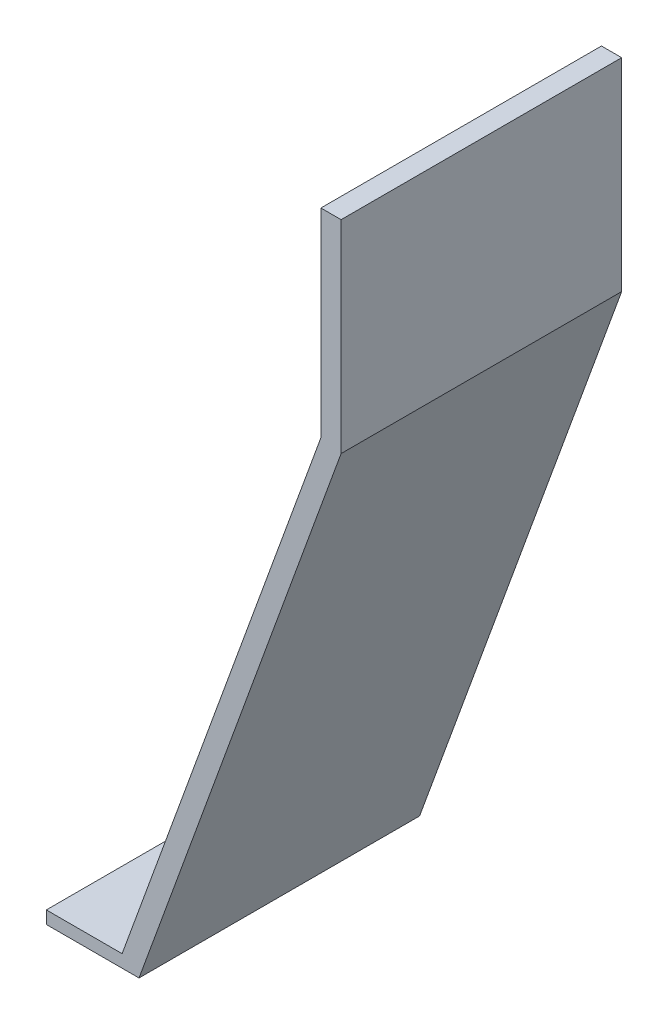
ISO-10303-21;
HEADER;
FILE_DESCRIPTION(('STEP AP214'),'2;1');
FILE_NAME('part.step','',(''),(''),'','','');
FILE_SCHEMA(('AUTOMOTIVE_DESIGN { 1 0 10303 214 1 1 1 1 }'));
ENDSEC;
DATA;
#1=APPLICATION_CONTEXT('core data for automotive mechanical design processes');
#2=APPLICATION_PROTOCOL_DEFINITION('international standard','automotive_design',2000,#1);
#3=PRODUCT_CONTEXT('',#1,'mechanical');
#4=PRODUCT('Part','Part','',(#3));
#5=PRODUCT_RELATED_PRODUCT_CATEGORY('part','',(#4));
#6=PRODUCT_DEFINITION_FORMATION('','',#4);
#7=PRODUCT_DEFINITION_CONTEXT('part definition',#1,'design');
#8=PRODUCT_DEFINITION('design','',#6,#7);
#9=PRODUCT_DEFINITION_SHAPE('','',#8);
#10=(LENGTH_UNIT() NAMED_UNIT(*) SI_UNIT(.MILLI.,.METRE.));
#11=(NAMED_UNIT(*) PLANE_ANGLE_UNIT() SI_UNIT($,.RADIAN.));
#12=(NAMED_UNIT(*) SI_UNIT($,.STERADIAN.) SOLID_ANGLE_UNIT());
#13=UNCERTAINTY_MEASURE_WITH_UNIT(LENGTH_MEASURE(1.E-05),#10,'distance_accuracy_value','');
#14=(GEOMETRIC_REPRESENTATION_CONTEXT(3) GLOBAL_UNCERTAINTY_ASSIGNED_CONTEXT((#13)) GLOBAL_UNIT_ASSIGNED_CONTEXT((#10,
#11,#12)) REPRESENTATION_CONTEXT('',''));
#15=CARTESIAN_POINT('',(0.,0.,0.));
#16=DIRECTION('',(0.,0.,1.));
#17=DIRECTION('',(1.,0.,0.));
#18=AXIS2_PLACEMENT_3D('',#15,#16,#17);
#19=CARTESIAN_POINT('',(0.,2.5,55.54));
#20=DIRECTION('',(1.,0.,0.));
#21=DIRECTION('',(0.,0.,-1.));
#22=AXIS2_PLACEMENT_3D('',#19,#20,#21);
#23=PLANE('',#22);
#24=DIRECTION('',(0.,-1.,0.));
#25=VECTOR('',#24,1.);
#26=CARTESIAN_POINT('',(0.,2.5,0.));
#27=LINE('',#26,#25);
#28=CARTESIAN_POINT('',(0.,2.5,0.));
#29=VERTEX_POINT('',#28);
#30=CARTESIAN_POINT('',(0.,0.,0.));
#31=VERTEX_POINT('',#30);
#32=EDGE_CURVE('E133',#29,#31,#27,.T.);
#33=ORIENTED_EDGE('',*,*,#32,.T.);
#34=DIRECTION('',(0.,0.,-1.));
#35=VECTOR('',#34,1.);
#36=CARTESIAN_POINT('',(0.,0.,55.54));
#37=LINE('',#36,#35);
#38=CARTESIAN_POINT('',(0.,0.,55.54));
#39=VERTEX_POINT('',#38);
#40=EDGE_CURVE('E11',#39,#31,#37,.T.);
#41=ORIENTED_EDGE('',*,*,#40,.F.);
#42=DIRECTION('',(0.,-1.,0.));
#43=VECTOR('',#42,1.);
#44=CARTESIAN_POINT('',(0.,2.5,55.54));
#45=LINE('',#44,#43);
#46=CARTESIAN_POINT('',(0.,2.5,55.54));
#47=VERTEX_POINT('',#46);
#48=EDGE_CURVE('E149',#47,#39,#45,.T.);
#49=ORIENTED_EDGE('',*,*,#48,.F.);
#50=DIRECTION('',(0.,0.,-1.));
#51=VECTOR('',#50,1.);
#52=CARTESIAN_POINT('',(0.,2.5,55.54));
#53=LINE('',#52,#51);
#54=EDGE_CURVE('E132',#47,#29,#53,.T.);
#55=ORIENTED_EDGE('',*,*,#54,.T.);
#56=EDGE_LOOP('',(#33,#41,#49,#55));
#57=FACE_BOUND('',#56,.T.);
#58=ADVANCED_FACE('F39',(#57),#23,.F.);
#59=CARTESIAN_POINT('',(0.,0.,55.54));
#60=DIRECTION('',(0.,1.,0.));
#61=DIRECTION('',(0.,0.,1.));
#62=AXIS2_PLACEMENT_3D('',#59,#60,#61);
#63=PLANE('',#62);
#64=DIRECTION('',(1.,0.,0.));
#65=VECTOR('',#64,1.);
#66=CARTESIAN_POINT('',(0.,0.,0.));
#67=LINE('',#66,#65);
#68=CARTESIAN_POINT('',(18.3467855042381,0.,0.));
#69=VERTEX_POINT('',#68);
#70=EDGE_CURVE('E137',#31,#69,#67,.T.);
#71=ORIENTED_EDGE('',*,*,#70,.T.);
#72=DIRECTION('',(0.,0.,-1.));
#73=VECTOR('',#72,1.);
#74=CARTESIAN_POINT('',(18.3467855042381,0.,55.54));
#75=LINE('',#74,#73);
#76=CARTESIAN_POINT('',(18.3467855042381,0.,55.54));
#77=VERTEX_POINT('',#76);
#78=EDGE_CURVE('E50',#77,#69,#75,.T.);
#79=ORIENTED_EDGE('',*,*,#78,.F.);
#80=DIRECTION('',(1.,0.,0.));
#81=VECTOR('',#80,1.);
#82=CARTESIAN_POINT('',(0.,0.,55.54));
#83=LINE('',#82,#81);
#84=EDGE_CURVE('E98',#39,#77,#83,.T.);
#85=ORIENTED_EDGE('',*,*,#84,.F.);
#86=ORIENTED_EDGE('',*,*,#40,.T.);
#87=EDGE_LOOP('',(#71,#79,#85,#86));
#88=FACE_BOUND('',#87,.T.);
#89=ADVANCED_FACE('F184',(#88),#63,.F.);
#90=CARTESIAN_POINT('',(18.3467855042381,0.,55.54));
#91=DIRECTION('',(-0.93969262078591,0.342020143325665,0.));
#92=DIRECTION('',(-0.342020143325665,-0.93969262078591,0.));
#93=AXIS2_PLACEMENT_3D('',#90,#91,#92);
#94=PLANE('',#93);
#95=DIRECTION('',(0.342020143325665,0.93969262078591,0.));
#96=VECTOR('',#95,1.);
#97=CARTESIAN_POINT('',(18.3467855042381,0.,0.));
#98=LINE('',#97,#96);
#99=CARTESIAN_POINT('',(58.3467855042381,109.899096778186,0.));
#100=VERTEX_POINT('',#99);
#101=EDGE_CURVE('E139',#69,#100,#98,.T.);
#102=ORIENTED_EDGE('',*,*,#101,.T.);
#103=DIRECTION('',(0.,0.,-1.));
#104=VECTOR('',#103,1.);
#105=CARTESIAN_POINT('',(58.3467855042381,109.899096778186,55.54));
#106=LINE('',#105,#104);
#107=CARTESIAN_POINT('',(58.3467855042381,109.899096778186,55.54));
#108=VERTEX_POINT('',#107);
#109=EDGE_CURVE('E156',#108,#100,#106,.T.);
#110=ORIENTED_EDGE('',*,*,#109,.F.);
#111=DIRECTION('',(0.342020143325665,0.93969262078591,0.));
#112=VECTOR('',#111,1.);
#113=CARTESIAN_POINT('',(18.3467855042381,0.,55.54));
#114=LINE('',#113,#112);
#115=EDGE_CURVE('E163',#77,#108,#114,.T.);
#116=ORIENTED_EDGE('',*,*,#115,.F.);
#117=ORIENTED_EDGE('',*,*,#78,.T.);
#118=EDGE_LOOP('',(#102,#110,#116,#117));
#119=FACE_BOUND('',#118,.T.);
#120=ADVANCED_FACE('F165',(#119),#94,.F.);
#121=CARTESIAN_POINT('',(58.3467855042381,109.899096778186,55.54));
#122=DIRECTION('',(-1.,0.,0.));
#123=DIRECTION('',(0.,-1.,0.));
#124=AXIS2_PLACEMENT_3D('',#121,#122,#123);
#125=PLANE('',#124);
#126=DIRECTION('',(0.,1.,0.));
#127=VECTOR('',#126,1.);
#128=CARTESIAN_POINT('',(58.3467855042381,109.899096778186,0.));
#129=LINE('',#128,#127);
#130=CARTESIAN_POINT('',(58.3467855042381,150.,0.));
#131=VERTEX_POINT('',#130);
#132=EDGE_CURVE('E142',#100,#131,#129,.T.);
#133=ORIENTED_EDGE('',*,*,#132,.T.);
#134=DIRECTION('',(0.,0.,-1.));
#135=VECTOR('',#134,1.);
#136=CARTESIAN_POINT('',(58.3467855042381,150.,55.54));
#137=LINE('',#136,#135);
#138=CARTESIAN_POINT('',(58.3467855042381,150.,55.54));
#139=VERTEX_POINT('',#138);
#140=EDGE_CURVE('E153',#139,#131,#137,.T.);
#141=ORIENTED_EDGE('',*,*,#140,.F.);
#142=DIRECTION('',(0.,1.,0.));
#143=VECTOR('',#142,1.);
#144=CARTESIAN_POINT('',(58.3467855042381,109.899096778186,55.54));
#145=LINE('',#144,#143);
#146=EDGE_CURVE('E176',#108,#139,#145,.T.);
#147=ORIENTED_EDGE('',*,*,#146,.F.);
#148=ORIENTED_EDGE('',*,*,#109,.T.);
#149=EDGE_LOOP('',(#133,#141,#147,#148));
#150=FACE_BOUND('',#149,.T.);
#151=ADVANCED_FACE('F175',(#150),#125,.F.);
#152=CARTESIAN_POINT('',(58.3467855042381,150.,55.54));
#153=DIRECTION('',(0.,-1.,0.));
#154=DIRECTION('',(0.,0.,-1.));
#155=AXIS2_PLACEMENT_3D('',#152,#153,#154);
#156=PLANE('',#155);
#157=DIRECTION('',(-1.,0.,0.));
#158=VECTOR('',#157,1.);
#159=CARTESIAN_POINT('',(58.3467855042381,150.,0.));
#160=LINE('',#159,#158);
#161=CARTESIAN_POINT('',(54.3467855042381,150.,0.));
#162=VERTEX_POINT('',#161);
#163=EDGE_CURVE('E145',#131,#162,#160,.T.);
#164=ORIENTED_EDGE('',*,*,#163,.T.);
#165=DIRECTION('',(0.,0.,-1.));
#166=VECTOR('',#165,1.);
#167=CARTESIAN_POINT('',(54.3467855042381,150.,55.54));
#168=LINE('',#167,#166);
#169=CARTESIAN_POINT('',(54.3467855042381,150.,55.54));
#170=VERTEX_POINT('',#169);
#171=EDGE_CURVE('E127',#170,#162,#168,.T.);
#172=ORIENTED_EDGE('',*,*,#171,.F.);
#173=DIRECTION('',(-1.,0.,0.));
#174=VECTOR('',#173,1.);
#175=CARTESIAN_POINT('',(58.3467855042381,150.,55.54));
#176=LINE('',#175,#174);
#177=EDGE_CURVE('E120',#139,#170,#176,.T.);
#178=ORIENTED_EDGE('',*,*,#177,.F.);
#179=ORIENTED_EDGE('',*,*,#140,.T.);
#180=EDGE_LOOP('',(#164,#172,#178,#179));
#181=FACE_BOUND('',#180,.T.);
#182=ADVANCED_FACE('F173',(#181),#156,.F.);
#183=CARTESIAN_POINT('',(54.3467855042381,150.,55.54));
#184=DIRECTION('',(1.,0.,0.));
#185=DIRECTION('',(0.,1.,0.));
#186=AXIS2_PLACEMENT_3D('',#183,#184,#185);
#187=PLANE('',#186);
#188=DIRECTION('',(0.,-1.,0.));
#189=VECTOR('',#188,1.);
#190=CARTESIAN_POINT('',(54.3467855042381,150.,0.));
#191=LINE('',#190,#189);
#192=CARTESIAN_POINT('',(54.3467855042381,110.60440470102,0.));
#193=VERTEX_POINT('',#192);
#194=EDGE_CURVE('E124',#162,#193,#191,.T.);
#195=ORIENTED_EDGE('',*,*,#194,.T.);
#196=DIRECTION('',(0.,0.,-1.));
#197=VECTOR('',#196,1.);
#198=CARTESIAN_POINT('',(54.3467855042381,110.60440470102,55.54));
#199=LINE('',#198,#197);
#200=CARTESIAN_POINT('',(54.3467855042381,110.60440470102,55.54));
#201=VERTEX_POINT('',#200);
#202=EDGE_CURVE('E125',#201,#193,#199,.T.);
#203=ORIENTED_EDGE('',*,*,#202,.F.);
#204=DIRECTION('',(0.,-1.,0.));
#205=VECTOR('',#204,1.);
#206=CARTESIAN_POINT('',(54.3467855042381,150.,55.54));
#207=LINE('',#206,#205);
#208=EDGE_CURVE('E112',#170,#201,#207,.T.);
#209=ORIENTED_EDGE('',*,*,#208,.F.);
#210=ORIENTED_EDGE('',*,*,#171,.T.);
#211=EDGE_LOOP('',(#195,#203,#209,#210));
#212=FACE_BOUND('',#211,.T.);
#213=ADVANCED_FACE('F122',(#212),#187,.F.);
#214=CARTESIAN_POINT('',(54.3467855042381,110.60440470102,55.54));
#215=DIRECTION('',(0.93969262078591,-0.342020143325665,0.));
#216=DIRECTION('',(0.342020143325665,0.93969262078591,0.));
#217=AXIS2_PLACEMENT_3D('',#214,#215,#216);
#218=PLANE('',#217);
#219=DIRECTION('',(-0.342020143325665,-0.93969262078591,0.));
#220=VECTOR('',#219,1.);
#221=CARTESIAN_POINT('',(54.3467855042381,110.60440470102,0.));
#222=LINE('',#221,#220);
#223=CARTESIAN_POINT('',(15.,2.5,0.));
#224=VERTEX_POINT('',#223);
#225=EDGE_CURVE('E83',#193,#224,#222,.T.);
#226=ORIENTED_EDGE('',*,*,#225,.T.);
#227=DIRECTION('',(0.,0.,-1.));
#228=VECTOR('',#227,1.);
#229=CARTESIAN_POINT('',(15.,2.5,55.54));
#230=LINE('',#229,#228);
#231=CARTESIAN_POINT('',(15.,2.5,55.54));
#232=VERTEX_POINT('',#231);
#233=EDGE_CURVE('E130',#232,#224,#230,.T.);
#234=ORIENTED_EDGE('',*,*,#233,.F.);
#235=DIRECTION('',(-0.342020143325665,-0.93969262078591,0.));
#236=VECTOR('',#235,1.);
#237=CARTESIAN_POINT('',(54.3467855042381,110.60440470102,55.54));
#238=LINE('',#237,#236);
#239=EDGE_CURVE('E113',#201,#232,#238,.T.);
#240=ORIENTED_EDGE('',*,*,#239,.F.);
#241=ORIENTED_EDGE('',*,*,#202,.T.);
#242=EDGE_LOOP('',(#226,#234,#240,#241));
#243=FACE_BOUND('',#242,.T.);
#244=ADVANCED_FACE('F129',(#243),#218,.F.);
#245=CARTESIAN_POINT('',(15.,2.5,55.54));
#246=DIRECTION('',(0.,-1.,0.));
#247=DIRECTION('',(1.,0.,0.));
#248=AXIS2_PLACEMENT_3D('',#245,#246,#247);
#249=PLANE('',#248);
#250=DIRECTION('',(-1.,0.,0.));
#251=VECTOR('',#250,1.);
#252=CARTESIAN_POINT('',(15.,2.5,0.));
#253=LINE('',#252,#251);
#254=EDGE_CURVE('E89',#224,#29,#253,.T.);
#255=ORIENTED_EDGE('',*,*,#254,.T.);
#256=ORIENTED_EDGE('',*,*,#54,.F.);
#257=DIRECTION('',(-1.,0.,0.));
#258=VECTOR('',#257,1.);
#259=CARTESIAN_POINT('',(15.,2.5,55.54));
#260=LINE('',#259,#258);
#261=EDGE_CURVE('E54',#232,#47,#260,.T.);
#262=ORIENTED_EDGE('',*,*,#261,.F.);
#263=ORIENTED_EDGE('',*,*,#233,.T.);
#264=EDGE_LOOP('',(#255,#256,#262,#263));
#265=FACE_BOUND('',#264,.T.);
#266=ADVANCED_FACE('F199',(#265),#249,.F.);
#267=CARTESIAN_POINT('',(0.,0.,55.54));
#268=DIRECTION('',(0.,0.,1.));
#269=DIRECTION('',(1.,0.,0.));
#270=AXIS2_PLACEMENT_3D('',#267,#268,#269);
#271=PLANE('',#270);
#272=ORIENTED_EDGE('',*,*,#48,.T.);
#273=ORIENTED_EDGE('',*,*,#84,.T.);
#274=ORIENTED_EDGE('',*,*,#115,.T.);
#275=ORIENTED_EDGE('',*,*,#146,.T.);
#276=ORIENTED_EDGE('',*,*,#177,.T.);
#277=ORIENTED_EDGE('',*,*,#208,.T.);
#278=ORIENTED_EDGE('',*,*,#239,.T.);
#279=ORIENTED_EDGE('',*,*,#261,.T.);
#280=EDGE_LOOP('',(#272,#273,#274,#275,#276,#277,#278,#279));
#281=FACE_BOUND('',#280,.T.);
#282=ADVANCED_FACE('F114',(#281),#271,.T.);
#283=CARTESIAN_POINT('',(0.,0.,0.));
#284=DIRECTION('',(0.,0.,1.));
#285=DIRECTION('',(1.,0.,0.));
#286=AXIS2_PLACEMENT_3D('',#283,#284,#285);
#287=PLANE('',#286);
#288=ORIENTED_EDGE('',*,*,#32,.F.);
#289=ORIENTED_EDGE('',*,*,#254,.F.);
#290=ORIENTED_EDGE('',*,*,#225,.F.);
#291=ORIENTED_EDGE('',*,*,#194,.F.);
#292=ORIENTED_EDGE('',*,*,#163,.F.);
#293=ORIENTED_EDGE('',*,*,#132,.F.);
#294=ORIENTED_EDGE('',*,*,#101,.F.);
#295=ORIENTED_EDGE('',*,*,#70,.F.);
#296=EDGE_LOOP('',(#288,#289,#290,#291,#292,#293,#294,#295));
#297=FACE_BOUND('',#296,.T.);
#298=ADVANCED_FACE('F169',(#297),#287,.F.);
#299=CLOSED_SHELL('',(#58,#89,#120,#151,#182,#213,#244,#266,#282,#298));
#300=MANIFOLD_SOLID_BREP('B2',#299);
#301=ADVANCED_BREP_SHAPE_REPRESENTATION('',(#18,#300),#14);
#302=SHAPE_DEFINITION_REPRESENTATION(#9,#301);
ENDSEC;
END-ISO-10303-21;
